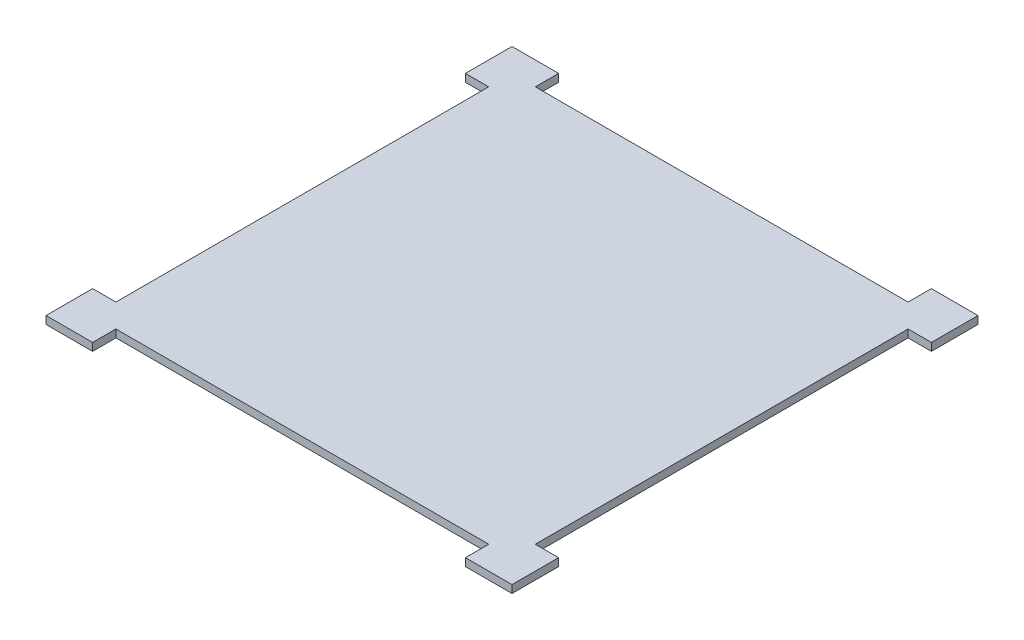
ISO-10303-21;
HEADER;
FILE_DESCRIPTION(('STEP AP214'),'2;1');
FILE_NAME('part.step','',(''),(''),'','','');
FILE_SCHEMA(('AUTOMOTIVE_DESIGN { 1 0 10303 214 1 1 1 1 }'));
ENDSEC;
DATA;
#1=APPLICATION_CONTEXT('core data for automotive mechanical design processes');
#2=APPLICATION_PROTOCOL_DEFINITION('international standard','automotive_design',2000,#1);
#3=PRODUCT_CONTEXT('',#1,'mechanical');
#4=PRODUCT('Part','Part','',(#3));
#5=PRODUCT_RELATED_PRODUCT_CATEGORY('part','',(#4));
#6=PRODUCT_DEFINITION_FORMATION('','',#4);
#7=PRODUCT_DEFINITION_CONTEXT('part definition',#1,'design');
#8=PRODUCT_DEFINITION('design','',#6,#7);
#9=PRODUCT_DEFINITION_SHAPE('','',#8);
#10=(LENGTH_UNIT() NAMED_UNIT(*) SI_UNIT(.MILLI.,.METRE.));
#11=(NAMED_UNIT(*) PLANE_ANGLE_UNIT() SI_UNIT($,.RADIAN.));
#12=(NAMED_UNIT(*) SI_UNIT($,.STERADIAN.) SOLID_ANGLE_UNIT());
#13=UNCERTAINTY_MEASURE_WITH_UNIT(LENGTH_MEASURE(1.E-05),#10,'distance_accuracy_value','');
#14=(GEOMETRIC_REPRESENTATION_CONTEXT(3) GLOBAL_UNCERTAINTY_ASSIGNED_CONTEXT((#13)) GLOBAL_UNIT_ASSIGNED_CONTEXT((#10,
#11,#12)) REPRESENTATION_CONTEXT('',''));
#15=CARTESIAN_POINT('',(0.,0.,0.));
#16=DIRECTION('',(0.,0.,1.));
#17=DIRECTION('',(1.,0.,0.));
#18=AXIS2_PLACEMENT_3D('',#15,#16,#17);
#19=CARTESIAN_POINT('',(-150.,5.,150.));
#20=DIRECTION('',(1.,0.,0.));
#21=DIRECTION('',(0.,0.,-1.));
#22=AXIS2_PLACEMENT_3D('',#19,#20,#21);
#23=PLANE('',#22);
#24=DIRECTION('',(0.,0.,1.));
#25=VECTOR('',#24,1.);
#26=CARTESIAN_POINT('',(-150.,0.,150.));
#27=LINE('',#26,#25);
#28=CARTESIAN_POINT('',(-150.,0.,120.));
#29=VERTEX_POINT('',#28);
#30=CARTESIAN_POINT('',(-150.,0.,150.));
#31=VERTEX_POINT('',#30);
#32=EDGE_CURVE('E205',#29,#31,#27,.T.);
#33=ORIENTED_EDGE('',*,*,#32,.T.);
#34=DIRECTION('',(0.,-1.,0.));
#35=VECTOR('',#34,1.);
#36=CARTESIAN_POINT('',(-150.,5.,150.));
#37=LINE('',#36,#35);
#38=CARTESIAN_POINT('',(-150.,5.,150.));
#39=VERTEX_POINT('',#38);
#40=EDGE_CURVE('E293',#39,#31,#37,.T.);
#41=ORIENTED_EDGE('',*,*,#40,.F.);
#42=DIRECTION('',(0.,0.,1.));
#43=VECTOR('',#42,1.);
#44=CARTESIAN_POINT('',(-150.,5.,150.));
#45=LINE('',#44,#43);
#46=CARTESIAN_POINT('',(-150.,5.,120.));
#47=VERTEX_POINT('',#46);
#48=EDGE_CURVE('E244',#47,#39,#45,.T.);
#49=ORIENTED_EDGE('',*,*,#48,.F.);
#50=DIRECTION('',(0.,-1.,0.));
#51=VECTOR('',#50,1.);
#52=CARTESIAN_POINT('',(-150.,5.,120.));
#53=LINE('',#52,#51);
#54=EDGE_CURVE('E201',#47,#29,#53,.T.);
#55=ORIENTED_EDGE('',*,*,#54,.T.);
#56=EDGE_LOOP('',(#33,#41,#49,#55));
#57=FACE_BOUND('',#56,.T.);
#58=ADVANCED_FACE('F36',(#57),#23,.F.);
#59=CARTESIAN_POINT('',(-150.,5.,150.));
#60=DIRECTION('',(0.,0.,-1.));
#61=DIRECTION('',(-1.,0.,0.));
#62=AXIS2_PLACEMENT_3D('',#59,#60,#61);
#63=PLANE('',#62);
#64=DIRECTION('',(1.,0.,0.));
#65=VECTOR('',#64,1.);
#66=CARTESIAN_POINT('',(-150.,0.,150.));
#67=LINE('',#66,#65);
#68=CARTESIAN_POINT('',(-120.,0.,150.));
#69=VERTEX_POINT('',#68);
#70=EDGE_CURVE('E208',#31,#69,#67,.T.);
#71=ORIENTED_EDGE('',*,*,#70,.T.);
#72=DIRECTION('',(0.,-1.,0.));
#73=VECTOR('',#72,1.);
#74=CARTESIAN_POINT('',(-120.,5.,150.));
#75=LINE('',#74,#73);
#76=CARTESIAN_POINT('',(-120.,5.,150.));
#77=VERTEX_POINT('',#76);
#78=EDGE_CURVE('E290',#77,#69,#75,.T.);
#79=ORIENTED_EDGE('',*,*,#78,.F.);
#80=DIRECTION('',(1.,0.,0.));
#81=VECTOR('',#80,1.);
#82=CARTESIAN_POINT('',(-150.,5.,150.));
#83=LINE('',#82,#81);
#84=EDGE_CURVE('E132',#39,#77,#83,.T.);
#85=ORIENTED_EDGE('',*,*,#84,.F.);
#86=ORIENTED_EDGE('',*,*,#40,.T.);
#87=EDGE_LOOP('',(#71,#79,#85,#86));
#88=FACE_BOUND('',#87,.T.);
#89=ADVANCED_FACE('F330',(#88),#63,.F.);
#90=CARTESIAN_POINT('',(-120.,5.,150.));
#91=DIRECTION('',(-1.,0.,0.));
#92=DIRECTION('',(0.,0.,1.));
#93=AXIS2_PLACEMENT_3D('',#90,#91,#92);
#94=PLANE('',#93);
#95=DIRECTION('',(0.,0.,-1.));
#96=VECTOR('',#95,1.);
#97=CARTESIAN_POINT('',(-120.,0.,150.));
#98=LINE('',#97,#96);
#99=CARTESIAN_POINT('',(-120.,0.,135.));
#100=VERTEX_POINT('',#99);
#101=EDGE_CURVE('E211',#69,#100,#98,.T.);
#102=ORIENTED_EDGE('',*,*,#101,.T.);
#103=DIRECTION('',(0.,-1.,0.));
#104=VECTOR('',#103,1.);
#105=CARTESIAN_POINT('',(-120.,5.,135.));
#106=LINE('',#105,#104);
#107=CARTESIAN_POINT('',(-120.,5.,135.));
#108=VERTEX_POINT('',#107);
#109=EDGE_CURVE('E287',#108,#100,#106,.T.);
#110=ORIENTED_EDGE('',*,*,#109,.F.);
#111=DIRECTION('',(0.,0.,-1.));
#112=VECTOR('',#111,1.);
#113=CARTESIAN_POINT('',(-120.,5.,150.));
#114=LINE('',#113,#112);
#115=EDGE_CURVE('E519',#77,#108,#114,.T.);
#116=ORIENTED_EDGE('',*,*,#115,.F.);
#117=ORIENTED_EDGE('',*,*,#78,.T.);
#118=EDGE_LOOP('',(#102,#110,#116,#117));
#119=FACE_BOUND('',#118,.T.);
#120=ADVANCED_FACE('F334',(#119),#94,.F.);
#121=CARTESIAN_POINT('',(-120.,5.,135.));
#122=DIRECTION('',(0.,0.,-1.));
#123=DIRECTION('',(-1.,0.,0.));
#124=AXIS2_PLACEMENT_3D('',#121,#122,#123);
#125=PLANE('',#124);
#126=DIRECTION('',(1.,0.,0.));
#127=VECTOR('',#126,1.);
#128=CARTESIAN_POINT('',(-120.,0.,135.));
#129=LINE('',#128,#127);
#130=CARTESIAN_POINT('',(119.999999999999,0.,135.000000000001));
#131=VERTEX_POINT('',#130);
#132=EDGE_CURVE('E213',#100,#131,#129,.T.);
#133=ORIENTED_EDGE('',*,*,#132,.T.);
#134=DIRECTION('',(0.,-1.,0.));
#135=VECTOR('',#134,1.);
#136=CARTESIAN_POINT('',(119.999999999999,5.,135.000000000001));
#137=LINE('',#136,#135);
#138=CARTESIAN_POINT('',(119.999999999999,5.,135.000000000001));
#139=VERTEX_POINT('',#138);
#140=EDGE_CURVE('E284',#139,#131,#137,.T.);
#141=ORIENTED_EDGE('',*,*,#140,.F.);
#142=DIRECTION('',(1.,0.,0.));
#143=VECTOR('',#142,1.);
#144=CARTESIAN_POINT('',(-120.,5.,135.));
#145=LINE('',#144,#143);
#146=EDGE_CURVE('E521',#108,#139,#145,.T.);
#147=ORIENTED_EDGE('',*,*,#146,.F.);
#148=ORIENTED_EDGE('',*,*,#109,.T.);
#149=EDGE_LOOP('',(#133,#141,#147,#148));
#150=FACE_BOUND('',#149,.T.);
#151=ADVANCED_FACE('F338',(#150),#125,.F.);
#152=CARTESIAN_POINT('',(119.999999999998,5.,150.000000000001));
#153=DIRECTION('',(1.,0.,0.));
#154=DIRECTION('',(0.,0.,-1.));
#155=AXIS2_PLACEMENT_3D('',#152,#153,#154);
#156=PLANE('',#155);
#157=DIRECTION('',(0.,0.,1.));
#158=VECTOR('',#157,1.);
#159=CARTESIAN_POINT('',(119.999999999998,0.,150.000000000001));
#160=LINE('',#159,#158);
#161=CARTESIAN_POINT('',(119.999999999998,0.,150.000000000001));
#162=VERTEX_POINT('',#161);
#163=EDGE_CURVE('E215',#131,#162,#160,.T.);
#164=ORIENTED_EDGE('',*,*,#163,.T.);
#165=DIRECTION('',(0.,-1.,0.));
#166=VECTOR('',#165,1.);
#167=CARTESIAN_POINT('',(119.999999999998,5.,150.000000000001));
#168=LINE('',#167,#166);
#169=CARTESIAN_POINT('',(119.999999999998,5.,150.000000000001));
#170=VERTEX_POINT('',#169);
#171=EDGE_CURVE('E281',#170,#162,#168,.T.);
#172=ORIENTED_EDGE('',*,*,#171,.F.);
#173=DIRECTION('',(0.,0.,1.));
#174=VECTOR('',#173,1.);
#175=CARTESIAN_POINT('',(119.999999999998,5.,150.000000000001));
#176=LINE('',#175,#174);
#177=EDGE_CURVE('E523',#139,#170,#176,.T.);
#178=ORIENTED_EDGE('',*,*,#177,.F.);
#179=ORIENTED_EDGE('',*,*,#140,.T.);
#180=EDGE_LOOP('',(#164,#172,#178,#179));
#181=FACE_BOUND('',#180,.T.);
#182=ADVANCED_FACE('F344',(#181),#156,.F.);
#183=CARTESIAN_POINT('',(149.999999999998,5.,150.000000000002));
#184=DIRECTION('',(0.,0.,-1.));
#185=DIRECTION('',(-1.,0.,0.));
#186=AXIS2_PLACEMENT_3D('',#183,#184,#185);
#187=PLANE('',#186);
#188=DIRECTION('',(1.,0.,0.));
#189=VECTOR('',#188,1.);
#190=CARTESIAN_POINT('',(149.999999999998,0.,150.000000000002));
#191=LINE('',#190,#189);
#192=CARTESIAN_POINT('',(149.999999999998,0.,150.000000000002));
#193=VERTEX_POINT('',#192);
#194=EDGE_CURVE('E217',#162,#193,#191,.T.);
#195=ORIENTED_EDGE('',*,*,#194,.T.);
#196=DIRECTION('',(0.,-1.,0.));
#197=VECTOR('',#196,1.);
#198=CARTESIAN_POINT('',(149.999999999998,5.,150.000000000002));
#199=LINE('',#198,#197);
#200=CARTESIAN_POINT('',(149.999999999998,5.,150.000000000002));
#201=VERTEX_POINT('',#200);
#202=EDGE_CURVE('E278',#201,#193,#199,.T.);
#203=ORIENTED_EDGE('',*,*,#202,.F.);
#204=DIRECTION('',(1.,0.,0.));
#205=VECTOR('',#204,1.);
#206=CARTESIAN_POINT('',(149.999999999998,5.,150.000000000002));
#207=LINE('',#206,#205);
#208=EDGE_CURVE('E525',#170,#201,#207,.T.);
#209=ORIENTED_EDGE('',*,*,#208,.F.);
#210=ORIENTED_EDGE('',*,*,#171,.T.);
#211=EDGE_LOOP('',(#195,#203,#209,#210));
#212=FACE_BOUND('',#211,.T.);
#213=ADVANCED_FACE('F348',(#212),#187,.F.);
#214=CARTESIAN_POINT('',(149.999999999998,5.,150.000000000002));
#215=DIRECTION('',(-1.,0.,0.));
#216=DIRECTION('',(0.,0.,1.));
#217=AXIS2_PLACEMENT_3D('',#214,#215,#216);
#218=PLANE('',#217);
#219=DIRECTION('',(0.,0.,-1.));
#220=VECTOR('',#219,1.);
#221=CARTESIAN_POINT('',(149.999999999998,0.,150.000000000002));
#222=LINE('',#221,#220);
#223=CARTESIAN_POINT('',(149.999999999999,0.,120.000000000002));
#224=VERTEX_POINT('',#223);
#225=EDGE_CURVE('E219',#193,#224,#222,.T.);
#226=ORIENTED_EDGE('',*,*,#225,.T.);
#227=DIRECTION('',(0.,-1.,0.));
#228=VECTOR('',#227,1.);
#229=CARTESIAN_POINT('',(149.999999999999,5.,120.000000000002));
#230=LINE('',#229,#228);
#231=CARTESIAN_POINT('',(149.999999999999,5.,120.000000000002));
#232=VERTEX_POINT('',#231);
#233=EDGE_CURVE('E275',#232,#224,#230,.T.);
#234=ORIENTED_EDGE('',*,*,#233,.F.);
#235=DIRECTION('',(0.,0.,-1.));
#236=VECTOR('',#235,1.);
#237=CARTESIAN_POINT('',(149.999999999998,5.,150.000000000002));
#238=LINE('',#237,#236);
#239=EDGE_CURVE('E527',#201,#232,#238,.T.);
#240=ORIENTED_EDGE('',*,*,#239,.F.);
#241=ORIENTED_EDGE('',*,*,#202,.T.);
#242=EDGE_LOOP('',(#226,#234,#240,#241));
#243=FACE_BOUND('',#242,.T.);
#244=ADVANCED_FACE('F352',(#243),#218,.F.);
#245=CARTESIAN_POINT('',(149.999999999999,5.,120.000000000002));
#246=DIRECTION('',(0.,0.,1.));
#247=DIRECTION('',(1.,0.,0.));
#248=AXIS2_PLACEMENT_3D('',#245,#246,#247);
#249=PLANE('',#248);
#250=DIRECTION('',(-1.,0.,0.));
#251=VECTOR('',#250,1.);
#252=CARTESIAN_POINT('',(149.999999999999,0.,120.000000000002));
#253=LINE('',#252,#251);
#254=CARTESIAN_POINT('',(134.999999999999,0.,120.000000000001));
#255=VERTEX_POINT('',#254);
#256=EDGE_CURVE('E221',#224,#255,#253,.T.);
#257=ORIENTED_EDGE('',*,*,#256,.T.);
#258=DIRECTION('',(0.,-1.,0.));
#259=VECTOR('',#258,1.);
#260=CARTESIAN_POINT('',(134.999999999999,5.,120.000000000001));
#261=LINE('',#260,#259);
#262=CARTESIAN_POINT('',(134.999999999999,5.,120.000000000001));
#263=VERTEX_POINT('',#262);
#264=EDGE_CURVE('E272',#263,#255,#261,.T.);
#265=ORIENTED_EDGE('',*,*,#264,.F.);
#266=DIRECTION('',(-1.,0.,0.));
#267=VECTOR('',#266,1.);
#268=CARTESIAN_POINT('',(149.999999999999,5.,120.000000000002));
#269=LINE('',#268,#267);
#270=EDGE_CURVE('E529',#232,#263,#269,.T.);
#271=ORIENTED_EDGE('',*,*,#270,.F.);
#272=ORIENTED_EDGE('',*,*,#233,.T.);
#273=EDGE_LOOP('',(#257,#265,#271,#272));
#274=FACE_BOUND('',#273,.T.);
#275=ADVANCED_FACE('F356',(#274),#249,.F.);
#276=CARTESIAN_POINT('',(134.999999999999,5.,120.000000000001));
#277=DIRECTION('',(-1.,0.,0.));
#278=DIRECTION('',(0.,0.,1.));
#279=AXIS2_PLACEMENT_3D('',#276,#277,#278);
#280=PLANE('',#279);
#281=DIRECTION('',(0.,0.,-1.));
#282=VECTOR('',#281,1.);
#283=CARTESIAN_POINT('',(134.999999999999,0.,120.000000000001));
#284=LINE('',#283,#282);
#285=CARTESIAN_POINT('',(135.000000000001,0.,-119.999999999999));
#286=VERTEX_POINT('',#285);
#287=EDGE_CURVE('E223',#255,#286,#284,.T.);
#288=ORIENTED_EDGE('',*,*,#287,.T.);
#289=DIRECTION('',(0.,-1.,0.));
#290=VECTOR('',#289,1.);
#291=CARTESIAN_POINT('',(135.000000000001,5.,-119.999999999999));
#292=LINE('',#291,#290);
#293=CARTESIAN_POINT('',(135.000000000001,5.,-119.999999999999));
#294=VERTEX_POINT('',#293);
#295=EDGE_CURVE('E269',#294,#286,#292,.T.);
#296=ORIENTED_EDGE('',*,*,#295,.F.);
#297=DIRECTION('',(0.,0.,-1.));
#298=VECTOR('',#297,1.);
#299=CARTESIAN_POINT('',(134.999999999999,5.,120.000000000001));
#300=LINE('',#299,#298);
#301=EDGE_CURVE('E531',#263,#294,#300,.T.);
#302=ORIENTED_EDGE('',*,*,#301,.F.);
#303=ORIENTED_EDGE('',*,*,#264,.T.);
#304=EDGE_LOOP('',(#288,#296,#302,#303));
#305=FACE_BOUND('',#304,.T.);
#306=ADVANCED_FACE('F360',(#305),#280,.F.);
#307=CARTESIAN_POINT('',(150.000000000001,5.,-119.999999999999));
#308=DIRECTION('',(0.,0.,-1.));
#309=DIRECTION('',(-1.,0.,0.));
#310=AXIS2_PLACEMENT_3D('',#307,#308,#309);
#311=PLANE('',#310);
#312=DIRECTION('',(1.,0.,0.));
#313=VECTOR('',#312,1.);
#314=CARTESIAN_POINT('',(150.000000000001,0.,-119.999999999999));
#315=LINE('',#314,#313);
#316=CARTESIAN_POINT('',(150.000000000001,0.,-119.999999999999));
#317=VERTEX_POINT('',#316);
#318=EDGE_CURVE('E225',#286,#317,#315,.T.);
#319=ORIENTED_EDGE('',*,*,#318,.T.);
#320=DIRECTION('',(0.,-1.,0.));
#321=VECTOR('',#320,1.);
#322=CARTESIAN_POINT('',(150.000000000001,5.,-119.999999999999));
#323=LINE('',#322,#321);
#324=CARTESIAN_POINT('',(150.000000000001,5.,-119.999999999999));
#325=VERTEX_POINT('',#324);
#326=EDGE_CURVE('E266',#325,#317,#323,.T.);
#327=ORIENTED_EDGE('',*,*,#326,.F.);
#328=DIRECTION('',(1.,0.,0.));
#329=VECTOR('',#328,1.);
#330=CARTESIAN_POINT('',(150.000000000001,5.,-119.999999999999));
#331=LINE('',#330,#329);
#332=EDGE_CURVE('E533',#294,#325,#331,.T.);
#333=ORIENTED_EDGE('',*,*,#332,.F.);
#334=ORIENTED_EDGE('',*,*,#295,.T.);
#335=EDGE_LOOP('',(#319,#327,#333,#334));
#336=FACE_BOUND('',#335,.T.);
#337=ADVANCED_FACE('F364',(#336),#311,.F.);
#338=CARTESIAN_POINT('',(150.000000000001,5.,-149.999999999999));
#339=DIRECTION('',(-1.,0.,0.));
#340=DIRECTION('',(0.,0.,1.));
#341=AXIS2_PLACEMENT_3D('',#338,#339,#340);
#342=PLANE('',#341);
#343=DIRECTION('',(0.,0.,-1.));
#344=VECTOR('',#343,1.);
#345=CARTESIAN_POINT('',(150.000000000001,0.,-149.999999999999));
#346=LINE('',#345,#344);
#347=CARTESIAN_POINT('',(150.000000000001,0.,-149.999999999999));
#348=VERTEX_POINT('',#347);
#349=EDGE_CURVE('E227',#317,#348,#346,.T.);
#350=ORIENTED_EDGE('',*,*,#349,.T.);
#351=DIRECTION('',(0.,-1.,0.));
#352=VECTOR('',#351,1.);
#353=CARTESIAN_POINT('',(150.000000000001,5.,-149.999999999999));
#354=LINE('',#353,#352);
#355=CARTESIAN_POINT('',(150.000000000001,5.,-149.999999999999));
#356=VERTEX_POINT('',#355);
#357=EDGE_CURVE('E263',#356,#348,#354,.T.);
#358=ORIENTED_EDGE('',*,*,#357,.F.);
#359=DIRECTION('',(0.,0.,-1.));
#360=VECTOR('',#359,1.);
#361=CARTESIAN_POINT('',(150.000000000001,5.,-149.999999999999));
#362=LINE('',#361,#360);
#363=EDGE_CURVE('E535',#325,#356,#362,.T.);
#364=ORIENTED_EDGE('',*,*,#363,.F.);
#365=ORIENTED_EDGE('',*,*,#326,.T.);
#366=EDGE_LOOP('',(#350,#358,#364,#365));
#367=FACE_BOUND('',#366,.T.);
#368=ADVANCED_FACE('F368',(#367),#342,.F.);
#369=CARTESIAN_POINT('',(150.000000000001,5.,-149.999999999999));
#370=DIRECTION('',(0.,0.,1.));
#371=DIRECTION('',(1.,0.,0.));
#372=AXIS2_PLACEMENT_3D('',#369,#370,#371);
#373=PLANE('',#372);
#374=DIRECTION('',(-1.,0.,0.));
#375=VECTOR('',#374,1.);
#376=CARTESIAN_POINT('',(150.000000000001,0.,-149.999999999999));
#377=LINE('',#376,#375);
#378=CARTESIAN_POINT('',(120.000000000001,0.,-149.999999999999));
#379=VERTEX_POINT('',#378);
#380=EDGE_CURVE('E229',#348,#379,#377,.T.);
#381=ORIENTED_EDGE('',*,*,#380,.T.);
#382=DIRECTION('',(0.,-1.,0.));
#383=VECTOR('',#382,1.);
#384=CARTESIAN_POINT('',(120.000000000001,5.,-149.999999999999));
#385=LINE('',#384,#383);
#386=CARTESIAN_POINT('',(120.000000000001,5.,-149.999999999999));
#387=VERTEX_POINT('',#386);
#388=EDGE_CURVE('E260',#387,#379,#385,.T.);
#389=ORIENTED_EDGE('',*,*,#388,.F.);
#390=DIRECTION('',(-1.,0.,0.));
#391=VECTOR('',#390,1.);
#392=CARTESIAN_POINT('',(150.000000000001,5.,-149.999999999999));
#393=LINE('',#392,#391);
#394=EDGE_CURVE('E537',#356,#387,#393,.T.);
#395=ORIENTED_EDGE('',*,*,#394,.F.);
#396=ORIENTED_EDGE('',*,*,#357,.T.);
#397=EDGE_LOOP('',(#381,#389,#395,#396));
#398=FACE_BOUND('',#397,.T.);
#399=ADVANCED_FACE('F372',(#398),#373,.F.);
#400=CARTESIAN_POINT('',(120.000000000001,5.,-149.999999999999));
#401=DIRECTION('',(1.,0.,0.));
#402=DIRECTION('',(0.,0.,-1.));
#403=AXIS2_PLACEMENT_3D('',#400,#401,#402);
#404=PLANE('',#403);
#405=DIRECTION('',(0.,0.,1.));
#406=VECTOR('',#405,1.);
#407=CARTESIAN_POINT('',(120.000000000001,0.,-149.999999999999));
#408=LINE('',#407,#406);
#409=CARTESIAN_POINT('',(120.000000000001,0.,-134.999999999999));
#410=VERTEX_POINT('',#409);
#411=EDGE_CURVE('E231',#379,#410,#408,.T.);
#412=ORIENTED_EDGE('',*,*,#411,.T.);
#413=DIRECTION('',(0.,-1.,0.));
#414=VECTOR('',#413,1.);
#415=CARTESIAN_POINT('',(120.000000000001,5.,-134.999999999999));
#416=LINE('',#415,#414);
#417=CARTESIAN_POINT('',(120.000000000001,5.,-134.999999999999));
#418=VERTEX_POINT('',#417);
#419=EDGE_CURVE('E257',#418,#410,#416,.T.);
#420=ORIENTED_EDGE('',*,*,#419,.F.);
#421=DIRECTION('',(0.,0.,1.));
#422=VECTOR('',#421,1.);
#423=CARTESIAN_POINT('',(120.000000000001,5.,-149.999999999999));
#424=LINE('',#423,#422);
#425=EDGE_CURVE('E539',#387,#418,#424,.T.);
#426=ORIENTED_EDGE('',*,*,#425,.F.);
#427=ORIENTED_EDGE('',*,*,#388,.T.);
#428=EDGE_LOOP('',(#412,#420,#426,#427));
#429=FACE_BOUND('',#428,.T.);
#430=ADVANCED_FACE('F376',(#429),#404,.F.);
#431=CARTESIAN_POINT('',(-120.,5.,-135.));
#432=DIRECTION('',(0.,0.,1.));
#433=DIRECTION('',(1.,0.,0.));
#434=AXIS2_PLACEMENT_3D('',#431,#432,#433);
#435=PLANE('',#434);
#436=DIRECTION('',(-1.,0.,0.));
#437=VECTOR('',#436,1.);
#438=CARTESIAN_POINT('',(-120.,0.,-135.));
#439=LINE('',#438,#437);
#440=CARTESIAN_POINT('',(-120.,0.,-135.));
#441=VERTEX_POINT('',#440);
#442=EDGE_CURVE('E233',#410,#441,#439,.T.);
#443=ORIENTED_EDGE('',*,*,#442,.T.);
#444=DIRECTION('',(0.,-1.,0.));
#445=VECTOR('',#444,1.);
#446=CARTESIAN_POINT('',(-120.,5.,-135.));
#447=LINE('',#446,#445);
#448=CARTESIAN_POINT('',(-120.,5.,-135.));
#449=VERTEX_POINT('',#448);
#450=EDGE_CURVE('E254',#449,#441,#447,.T.);
#451=ORIENTED_EDGE('',*,*,#450,.F.);
#452=DIRECTION('',(-1.,0.,0.));
#453=VECTOR('',#452,1.);
#454=CARTESIAN_POINT('',(-120.,5.,-135.));
#455=LINE('',#454,#453);
#456=EDGE_CURVE('E541',#418,#449,#455,.T.);
#457=ORIENTED_EDGE('',*,*,#456,.F.);
#458=ORIENTED_EDGE('',*,*,#419,.T.);
#459=EDGE_LOOP('',(#443,#451,#457,#458));
#460=FACE_BOUND('',#459,.T.);
#461=ADVANCED_FACE('F380',(#460),#435,.F.);
#462=CARTESIAN_POINT('',(-120.,5.,-150.));
#463=DIRECTION('',(-1.,0.,0.));
#464=DIRECTION('',(0.,0.,1.));
#465=AXIS2_PLACEMENT_3D('',#462,#463,#464);
#466=PLANE('',#465);
#467=DIRECTION('',(0.,0.,-1.));
#468=VECTOR('',#467,1.);
#469=CARTESIAN_POINT('',(-120.,0.,-150.));
#470=LINE('',#469,#468);
#471=CARTESIAN_POINT('',(-120.,0.,-150.));
#472=VERTEX_POINT('',#471);
#473=EDGE_CURVE('E235',#441,#472,#470,.T.);
#474=ORIENTED_EDGE('',*,*,#473,.T.);
#475=DIRECTION('',(0.,-1.,0.));
#476=VECTOR('',#475,1.);
#477=CARTESIAN_POINT('',(-120.,5.,-150.));
#478=LINE('',#477,#476);
#479=CARTESIAN_POINT('',(-120.,5.,-150.));
#480=VERTEX_POINT('',#479);
#481=EDGE_CURVE('E251',#480,#472,#478,.T.);
#482=ORIENTED_EDGE('',*,*,#481,.F.);
#483=DIRECTION('',(0.,0.,-1.));
#484=VECTOR('',#483,1.);
#485=CARTESIAN_POINT('',(-120.,5.,-150.));
#486=LINE('',#485,#484);
#487=EDGE_CURVE('E543',#449,#480,#486,.T.);
#488=ORIENTED_EDGE('',*,*,#487,.F.);
#489=ORIENTED_EDGE('',*,*,#450,.T.);
#490=EDGE_LOOP('',(#474,#482,#488,#489));
#491=FACE_BOUND('',#490,.T.);
#492=ADVANCED_FACE('F384',(#491),#466,.F.);
#493=CARTESIAN_POINT('',(-149.999999999999,5.,-150.));
#494=DIRECTION('',(0.,0.,1.));
#495=DIRECTION('',(1.,0.,0.));
#496=AXIS2_PLACEMENT_3D('',#493,#494,#495);
#497=PLANE('',#496);
#498=DIRECTION('',(-1.,0.,0.));
#499=VECTOR('',#498,1.);
#500=CARTESIAN_POINT('',(-149.999999999999,0.,-150.));
#501=LINE('',#500,#499);
#502=CARTESIAN_POINT('',(-149.999999999999,0.,-150.));
#503=VERTEX_POINT('',#502);
#504=EDGE_CURVE('E237',#472,#503,#501,.T.);
#505=ORIENTED_EDGE('',*,*,#504,.T.);
#506=DIRECTION('',(0.,-1.,0.));
#507=VECTOR('',#506,1.);
#508=CARTESIAN_POINT('',(-149.999999999999,5.,-150.));
#509=LINE('',#508,#507);
#510=CARTESIAN_POINT('',(-149.999999999999,5.,-150.));
#511=VERTEX_POINT('',#510);
#512=EDGE_CURVE('E248',#511,#503,#509,.T.);
#513=ORIENTED_EDGE('',*,*,#512,.F.);
#514=DIRECTION('',(-1.,0.,0.));
#515=VECTOR('',#514,1.);
#516=CARTESIAN_POINT('',(-149.999999999999,5.,-150.));
#517=LINE('',#516,#515);
#518=EDGE_CURVE('E545',#480,#511,#517,.T.);
#519=ORIENTED_EDGE('',*,*,#518,.F.);
#520=ORIENTED_EDGE('',*,*,#481,.T.);
#521=EDGE_LOOP('',(#505,#513,#519,#520));
#522=FACE_BOUND('',#521,.T.);
#523=ADVANCED_FACE('F388',(#522),#497,.F.);
#524=CARTESIAN_POINT('',(-149.999999999999,5.,-150.));
#525=DIRECTION('',(1.,0.,0.));
#526=DIRECTION('',(0.,0.,-1.));
#527=AXIS2_PLACEMENT_3D('',#524,#525,#526);
#528=PLANE('',#527);
#529=DIRECTION('',(0.,0.,1.));
#530=VECTOR('',#529,1.);
#531=CARTESIAN_POINT('',(-149.999999999999,0.,-150.));
#532=LINE('',#531,#530);
#533=CARTESIAN_POINT('',(-150.,0.,-120.));
#534=VERTEX_POINT('',#533);
#535=EDGE_CURVE('E239',#503,#534,#532,.T.);
#536=ORIENTED_EDGE('',*,*,#535,.T.);
#537=DIRECTION('',(0.,-1.,0.));
#538=VECTOR('',#537,1.);
#539=CARTESIAN_POINT('',(-150.,5.,-120.));
#540=LINE('',#539,#538);
#541=CARTESIAN_POINT('',(-150.,5.,-120.));
#542=VERTEX_POINT('',#541);
#543=EDGE_CURVE('E196',#542,#534,#540,.T.);
#544=ORIENTED_EDGE('',*,*,#543,.F.);
#545=DIRECTION('',(0.,0.,1.));
#546=VECTOR('',#545,1.);
#547=CARTESIAN_POINT('',(-149.999999999999,5.,-150.));
#548=LINE('',#547,#546);
#549=EDGE_CURVE('E187',#511,#542,#548,.T.);
#550=ORIENTED_EDGE('',*,*,#549,.F.);
#551=ORIENTED_EDGE('',*,*,#512,.T.);
#552=EDGE_LOOP('',(#536,#544,#550,#551));
#553=FACE_BOUND('',#552,.T.);
#554=ADVANCED_FACE('F392',(#553),#528,.F.);
#555=CARTESIAN_POINT('',(-150.,5.,-120.));
#556=DIRECTION('',(0.,0.,-1.));
#557=DIRECTION('',(-1.,0.,0.));
#558=AXIS2_PLACEMENT_3D('',#555,#556,#557);
#559=PLANE('',#558);
#560=DIRECTION('',(1.,0.,0.));
#561=VECTOR('',#560,1.);
#562=CARTESIAN_POINT('',(-150.,0.,-120.));
#563=LINE('',#562,#561);
#564=CARTESIAN_POINT('',(-135.,0.,-120.));
#565=VERTEX_POINT('',#564);
#566=EDGE_CURVE('E195',#534,#565,#563,.T.);
#567=ORIENTED_EDGE('',*,*,#566,.T.);
#568=DIRECTION('',(0.,-1.,0.));
#569=VECTOR('',#568,1.);
#570=CARTESIAN_POINT('',(-135.,5.,-120.));
#571=LINE('',#570,#569);
#572=CARTESIAN_POINT('',(-135.,5.,-120.));
#573=VERTEX_POINT('',#572);
#574=EDGE_CURVE('E192',#573,#565,#571,.T.);
#575=ORIENTED_EDGE('',*,*,#574,.F.);
#576=DIRECTION('',(1.,0.,0.));
#577=VECTOR('',#576,1.);
#578=CARTESIAN_POINT('',(-150.,5.,-120.));
#579=LINE('',#578,#577);
#580=EDGE_CURVE('E181',#542,#573,#579,.T.);
#581=ORIENTED_EDGE('',*,*,#580,.F.);
#582=ORIENTED_EDGE('',*,*,#543,.T.);
#583=EDGE_LOOP('',(#567,#575,#581,#582));
#584=FACE_BOUND('',#583,.T.);
#585=ADVANCED_FACE('F193',(#584),#559,.F.);
#586=CARTESIAN_POINT('',(-135.,5.,120.));
#587=DIRECTION('',(1.,0.,0.));
#588=DIRECTION('',(0.,0.,-1.));
#589=AXIS2_PLACEMENT_3D('',#586,#587,#588);
#590=PLANE('',#589);
#591=DIRECTION('',(0.,0.,1.));
#592=VECTOR('',#591,1.);
#593=CARTESIAN_POINT('',(-135.,0.,120.));
#594=LINE('',#593,#592);
#595=CARTESIAN_POINT('',(-135.,0.,120.));
#596=VERTEX_POINT('',#595);
#597=EDGE_CURVE('E117',#565,#596,#594,.T.);
#598=ORIENTED_EDGE('',*,*,#597,.T.);
#599=DIRECTION('',(0.,-1.,0.));
#600=VECTOR('',#599,1.);
#601=CARTESIAN_POINT('',(-135.,5.,120.));
#602=LINE('',#601,#600);
#603=CARTESIAN_POINT('',(-135.,5.,120.));
#604=VERTEX_POINT('',#603);
#605=EDGE_CURVE('E197',#604,#596,#602,.T.);
#606=ORIENTED_EDGE('',*,*,#605,.F.);
#607=DIRECTION('',(0.,0.,1.));
#608=VECTOR('',#607,1.);
#609=CARTESIAN_POINT('',(-135.,5.,120.));
#610=LINE('',#609,#608);
#611=EDGE_CURVE('E185',#573,#604,#610,.T.);
#612=ORIENTED_EDGE('',*,*,#611,.F.);
#613=ORIENTED_EDGE('',*,*,#574,.T.);
#614=EDGE_LOOP('',(#598,#606,#612,#613));
#615=FACE_BOUND('',#614,.T.);
#616=ADVANCED_FACE('F199',(#615),#590,.F.);
#617=CARTESIAN_POINT('',(-150.,5.,120.));
#618=DIRECTION('',(0.,0.,1.));
#619=DIRECTION('',(1.,0.,0.));
#620=AXIS2_PLACEMENT_3D('',#617,#618,#619);
#621=PLANE('',#620);
#622=DIRECTION('',(-1.,0.,0.));
#623=VECTOR('',#622,1.);
#624=CARTESIAN_POINT('',(-150.,0.,120.));
#625=LINE('',#624,#623);
#626=EDGE_CURVE('E123',#596,#29,#625,.T.);
#627=ORIENTED_EDGE('',*,*,#626,.T.);
#628=ORIENTED_EDGE('',*,*,#54,.F.);
#629=DIRECTION('',(-1.,0.,0.));
#630=VECTOR('',#629,1.);
#631=CARTESIAN_POINT('',(-150.,5.,120.));
#632=LINE('',#631,#630);
#633=EDGE_CURVE('E52',#604,#47,#632,.T.);
#634=ORIENTED_EDGE('',*,*,#633,.F.);
#635=ORIENTED_EDGE('',*,*,#605,.T.);
#636=EDGE_LOOP('',(#627,#628,#634,#635));
#637=FACE_BOUND('',#636,.T.);
#638=ADVANCED_FACE('F320',(#637),#621,.F.);
#639=CARTESIAN_POINT('',(0.,5.,0.));
#640=DIRECTION('',(0.,-1.,0.));
#641=DIRECTION('',(0.,0.,-1.));
#642=AXIS2_PLACEMENT_3D('',#639,#640,#641);
#643=PLANE('',#642);
#644=ORIENTED_EDGE('',*,*,#48,.T.);
#645=ORIENTED_EDGE('',*,*,#84,.T.);
#646=ORIENTED_EDGE('',*,*,#115,.T.);
#647=ORIENTED_EDGE('',*,*,#146,.T.);
#648=ORIENTED_EDGE('',*,*,#177,.T.);
#649=ORIENTED_EDGE('',*,*,#208,.T.);
#650=ORIENTED_EDGE('',*,*,#239,.T.);
#651=ORIENTED_EDGE('',*,*,#270,.T.);
#652=ORIENTED_EDGE('',*,*,#301,.T.);
#653=ORIENTED_EDGE('',*,*,#332,.T.);
#654=ORIENTED_EDGE('',*,*,#363,.T.);
#655=ORIENTED_EDGE('',*,*,#394,.T.);
#656=ORIENTED_EDGE('',*,*,#425,.T.);
#657=ORIENTED_EDGE('',*,*,#456,.T.);
#658=ORIENTED_EDGE('',*,*,#487,.T.);
#659=ORIENTED_EDGE('',*,*,#518,.T.);
#660=ORIENTED_EDGE('',*,*,#549,.T.);
#661=ORIENTED_EDGE('',*,*,#580,.T.);
#662=ORIENTED_EDGE('',*,*,#611,.T.);
#663=ORIENTED_EDGE('',*,*,#633,.T.);
#664=EDGE_LOOP('',(#644,#645,#646,#647,#648,#649,#650,#651,#652,#653,#654,#655,#656,#657,#658,
#659,#660,#661,#662,#663));
#665=FACE_BOUND('',#664,.T.);
#666=ADVANCED_FACE('F183',(#665),#643,.F.);
#667=CARTESIAN_POINT('',(0.,0.,0.));
#668=DIRECTION('',(0.,-1.,0.));
#669=DIRECTION('',(0.,0.,-1.));
#670=AXIS2_PLACEMENT_3D('',#667,#668,#669);
#671=PLANE('',#670);
#672=CARTESIAN_POINT('',(88.3883476483175,0.,88.3883476483193));
#673=DIRECTION('',(0.,-1.,0.));
#674=DIRECTION('',(0.,0.,-1.));
#675=AXIS2_PLACEMENT_3D('',#672,#673,#674);
#676=CIRCLE('',#675,2.50000000000001);
#677=CARTESIAN_POINT('',(88.3883476483175,0.,85.8883476483193));
#678=VERTEX_POINT('',#677);
#679=EDGE_CURVE('E11',#678,#678,#676,.T.);
#680=ORIENTED_EDGE('',*,*,#679,.F.);
#681=EDGE_LOOP('',(#680));
#682=FACE_BOUND('',#681,.T.);
#683=CARTESIAN_POINT('',(-88.3883476483184,0.,88.3883476483185));
#684=DIRECTION('',(0.,-1.,0.));
#685=DIRECTION('',(0.,0.,-1.));
#686=AXIS2_PLACEMENT_3D('',#683,#684,#685);
#687=CIRCLE('',#686,2.5);
#688=CARTESIAN_POINT('',(-88.3883476483184,0.,85.8883476483185));
#689=VERTEX_POINT('',#688);
#690=EDGE_CURVE('E44',#689,#689,#687,.T.);
#691=ORIENTED_EDGE('',*,*,#690,.F.);
#692=EDGE_LOOP('',(#691));
#693=FACE_BOUND('',#692,.T.);
#694=CARTESIAN_POINT('',(88.388347648319,0.,-88.3883476483179));
#695=DIRECTION('',(0.,-1.,0.));
#696=DIRECTION('',(0.,0.,-1.));
#697=AXIS2_PLACEMENT_3D('',#694,#695,#696);
#698=CIRCLE('',#697,2.5);
#699=CARTESIAN_POINT('',(88.388347648319,0.,-90.8883476483179));
#700=VERTEX_POINT('',#699);
#701=EDGE_CURVE('E298',#700,#700,#698,.T.);
#702=ORIENTED_EDGE('',*,*,#701,.F.);
#703=EDGE_LOOP('',(#702));
#704=FACE_BOUND('',#703,.T.);
#705=CARTESIAN_POINT('',(-88.3883476483182,0.,-88.3883476483187));
#706=DIRECTION('',(0.,-1.,0.));
#707=DIRECTION('',(0.,0.,-1.));
#708=AXIS2_PLACEMENT_3D('',#705,#706,#707);
#709=CIRCLE('',#708,2.50000000000001);
#710=CARTESIAN_POINT('',(-88.3883476483182,0.,-90.8883476483187));
#711=VERTEX_POINT('',#710);
#712=EDGE_CURVE('E295',#711,#711,#709,.T.);
#713=ORIENTED_EDGE('',*,*,#712,.F.);
#714=EDGE_LOOP('',(#713));
#715=FACE_BOUND('',#714,.T.);
#716=ORIENTED_EDGE('',*,*,#32,.F.);
#717=ORIENTED_EDGE('',*,*,#626,.F.);
#718=ORIENTED_EDGE('',*,*,#597,.F.);
#719=ORIENTED_EDGE('',*,*,#566,.F.);
#720=ORIENTED_EDGE('',*,*,#535,.F.);
#721=ORIENTED_EDGE('',*,*,#504,.F.);
#722=ORIENTED_EDGE('',*,*,#473,.F.);
#723=ORIENTED_EDGE('',*,*,#442,.F.);
#724=ORIENTED_EDGE('',*,*,#411,.F.);
#725=ORIENTED_EDGE('',*,*,#380,.F.);
#726=ORIENTED_EDGE('',*,*,#349,.F.);
#727=ORIENTED_EDGE('',*,*,#318,.F.);
#728=ORIENTED_EDGE('',*,*,#287,.F.);
#729=ORIENTED_EDGE('',*,*,#256,.F.);
#730=ORIENTED_EDGE('',*,*,#225,.F.);
#731=ORIENTED_EDGE('',*,*,#194,.F.);
#732=ORIENTED_EDGE('',*,*,#163,.F.);
#733=ORIENTED_EDGE('',*,*,#132,.F.);
#734=ORIENTED_EDGE('',*,*,#101,.F.);
#735=ORIENTED_EDGE('',*,*,#70,.F.);
#736=EDGE_LOOP('',(#716,#717,#718,#719,#720,#721,#722,#723,#724,#725,#726,#727,#728,#729,#730,
#731,#732,#733,#734,#735));
#737=FACE_BOUND('',#736,.T.);
#738=ADVANCED_FACE('F305',(#682,#693,#704,#715,#737),#671,.T.);
#739=CARTESIAN_POINT('',(-88.3883476483182,-5.,-88.3883476483187));
#740=DIRECTION('',(0.,1.,0.));
#741=DIRECTION('',(0.,0.,1.));
#742=AXIS2_PLACEMENT_3D('',#739,#740,#741);
#743=CYLINDRICAL_SURFACE('',#742,2.50000000000001);
#744=CARTESIAN_POINT('',(-88.3883476483182,-5.,-88.3883476483187));
#745=DIRECTION('',(0.,1.,0.));
#746=DIRECTION('',(0.,0.,1.));
#747=AXIS2_PLACEMENT_3D('',#744,#745,#746);
#748=CIRCLE('',#747,2.50000000000001);
#749=CARTESIAN_POINT('',(-88.3883476483182,-5.,-85.8883476483187));
#750=VERTEX_POINT('',#749);
#751=EDGE_CURVE('E209',#750,#750,#748,.T.);
#752=ORIENTED_EDGE('',*,*,#751,.T.);
#753=EDGE_LOOP('',(#752));
#754=FACE_BOUND('',#753,.T.);
#755=ORIENTED_EDGE('',*,*,#712,.T.);
#756=EDGE_LOOP('',(#755));
#757=FACE_BOUND('',#756,.T.);
#758=ADVANCED_FACE('F308',(#754,#757),#743,.T.);
#759=CARTESIAN_POINT('',(-88.3883476483182,-5.,-88.3883476483187));
#760=DIRECTION('',(0.,1.,0.));
#761=DIRECTION('',(0.,0.,1.));
#762=AXIS2_PLACEMENT_3D('',#759,#760,#761);
#763=PLANE('',#762);
#764=ORIENTED_EDGE('',*,*,#751,.F.);
#765=EDGE_LOOP('',(#764));
#766=FACE_BOUND('',#765,.T.);
#767=ADVANCED_FACE('F431',(#766),#763,.F.);
#768=CARTESIAN_POINT('',(88.388347648319,-5.,-88.3883476483179));
#769=DIRECTION('',(0.,1.,0.));
#770=DIRECTION('',(0.,0.,1.));
#771=AXIS2_PLACEMENT_3D('',#768,#769,#770);
#772=CYLINDRICAL_SURFACE('',#771,2.5);
#773=CARTESIAN_POINT('',(88.388347648319,-5.,-88.3883476483179));
#774=DIRECTION('',(0.,1.,0.));
#775=DIRECTION('',(0.,0.,1.));
#776=AXIS2_PLACEMENT_3D('',#773,#774,#775);
#777=CIRCLE('',#776,2.5);
#778=CARTESIAN_POINT('',(88.388347648319,-5.,-85.8883476483179));
#779=VERTEX_POINT('',#778);
#780=EDGE_CURVE('E510',#779,#779,#777,.T.);
#781=ORIENTED_EDGE('',*,*,#780,.T.);
#782=EDGE_LOOP('',(#781));
#783=FACE_BOUND('',#782,.T.);
#784=ORIENTED_EDGE('',*,*,#701,.T.);
#785=EDGE_LOOP('',(#784));
#786=FACE_BOUND('',#785,.T.);
#787=ADVANCED_FACE('F441',(#783,#786),#772,.T.);
#788=CARTESIAN_POINT('',(88.388347648319,-5.,-88.3883476483179));
#789=DIRECTION('',(0.,1.,0.));
#790=DIRECTION('',(0.,0.,1.));
#791=AXIS2_PLACEMENT_3D('',#788,#789,#790);
#792=PLANE('',#791);
#793=ORIENTED_EDGE('',*,*,#780,.F.);
#794=EDGE_LOOP('',(#793));
#795=FACE_BOUND('',#794,.T.);
#796=ADVANCED_FACE('F451',(#795),#792,.F.);
#797=CARTESIAN_POINT('',(-88.3883476483184,-5.,88.3883476483185));
#798=DIRECTION('',(0.,1.,0.));
#799=DIRECTION('',(0.,0.,1.));
#800=AXIS2_PLACEMENT_3D('',#797,#798,#799);
#801=CYLINDRICAL_SURFACE('',#800,2.5);
#802=CARTESIAN_POINT('',(-88.3883476483184,-5.,88.3883476483185));
#803=DIRECTION('',(0.,1.,0.));
#804=DIRECTION('',(0.,0.,1.));
#805=AXIS2_PLACEMENT_3D('',#802,#803,#804);
#806=CIRCLE('',#805,2.5);
#807=CARTESIAN_POINT('',(-88.3883476483184,-5.,90.8883476483185));
#808=VERTEX_POINT('',#807);
#809=EDGE_CURVE('E507',#808,#808,#806,.T.);
#810=ORIENTED_EDGE('',*,*,#809,.T.);
#811=EDGE_LOOP('',(#810));
#812=FACE_BOUND('',#811,.T.);
#813=ORIENTED_EDGE('',*,*,#690,.T.);
#814=EDGE_LOOP('',(#813));
#815=FACE_BOUND('',#814,.T.);
#816=ADVANCED_FACE('F303',(#812,#815),#801,.T.);
#817=CARTESIAN_POINT('',(-88.3883476483184,-5.,88.3883476483185));
#818=DIRECTION('',(0.,1.,0.));
#819=DIRECTION('',(0.,0.,1.));
#820=AXIS2_PLACEMENT_3D('',#817,#818,#819);
#821=PLANE('',#820);
#822=ORIENTED_EDGE('',*,*,#809,.F.);
#823=EDGE_LOOP('',(#822));
#824=FACE_BOUND('',#823,.T.);
#825=ADVANCED_FACE('F470',(#824),#821,.F.);
#826=CARTESIAN_POINT('',(88.3883476483175,-5.,88.3883476483193));
#827=DIRECTION('',(0.,1.,0.));
#828=DIRECTION('',(0.,0.,1.));
#829=AXIS2_PLACEMENT_3D('',#826,#827,#828);
#830=CYLINDRICAL_SURFACE('',#829,2.50000000000001);
#831=CARTESIAN_POINT('',(88.3883476483175,-5.,88.3883476483193));
#832=DIRECTION('',(0.,1.,0.));
#833=DIRECTION('',(0.,0.,1.));
#834=AXIS2_PLACEMENT_3D('',#831,#832,#833);
#835=CIRCLE('',#834,2.50000000000001);
#836=CARTESIAN_POINT('',(88.3883476483175,-5.,90.8883476483194));
#837=VERTEX_POINT('',#836);
#838=EDGE_CURVE('E506',#837,#837,#835,.T.);
#839=ORIENTED_EDGE('',*,*,#838,.T.);
#840=EDGE_LOOP('',(#839));
#841=FACE_BOUND('',#840,.T.);
#842=ORIENTED_EDGE('',*,*,#679,.T.);
#843=EDGE_LOOP('',(#842));
#844=FACE_BOUND('',#843,.T.);
#845=ADVANCED_FACE('F480',(#841,#844),#830,.T.);
#846=CARTESIAN_POINT('',(88.3883476483175,-5.,88.3883476483193));
#847=DIRECTION('',(0.,1.,0.));
#848=DIRECTION('',(0.,0.,1.));
#849=AXIS2_PLACEMENT_3D('',#846,#847,#848);
#850=PLANE('',#849);
#851=ORIENTED_EDGE('',*,*,#838,.F.);
#852=EDGE_LOOP('',(#851));
#853=FACE_BOUND('',#852,.T.);
#854=ADVANCED_FACE('F490',(#853),#850,.F.);
#855=CLOSED_SHELL('',(#58,#89,#120,#151,#182,#213,#244,#275,#306,#337,#368,#399,#430,#461,#492,
#523,#554,#585,#616,#638,#666,#738,#758,#767,#787,#796,#816,#825,#845,#854));
#856=MANIFOLD_SOLID_BREP('B2',#855);
#857=ADVANCED_BREP_SHAPE_REPRESENTATION('',(#18,#856),#14);
#858=SHAPE_DEFINITION_REPRESENTATION(#9,#857);
ENDSEC;
END-ISO-10303-21;
